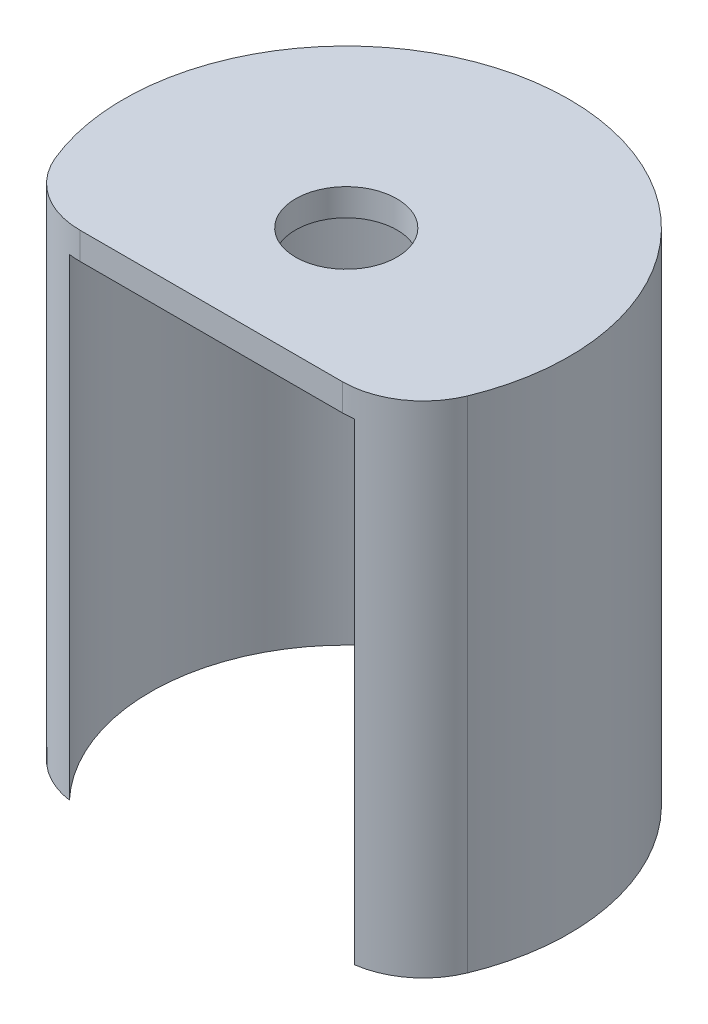
ISO-10303-21;
HEADER;
FILE_DESCRIPTION(('STEP AP214'),'2;1');
FILE_NAME('part.step','',(''),(''),'','','');
FILE_SCHEMA(('AUTOMOTIVE_DESIGN { 1 0 10303 214 1 1 1 1 }'));
ENDSEC;
DATA;
#1=APPLICATION_CONTEXT('core data for automotive mechanical design processes');
#2=APPLICATION_PROTOCOL_DEFINITION('international standard','automotive_design',2000,#1);
#3=PRODUCT_CONTEXT('',#1,'mechanical');
#4=PRODUCT('Part','Part','',(#3));
#5=PRODUCT_RELATED_PRODUCT_CATEGORY('part','',(#4));
#6=PRODUCT_DEFINITION_FORMATION('','',#4);
#7=PRODUCT_DEFINITION_CONTEXT('part definition',#1,'design');
#8=PRODUCT_DEFINITION('design','',#6,#7);
#9=PRODUCT_DEFINITION_SHAPE('','',#8);
#10=(LENGTH_UNIT() NAMED_UNIT(*) SI_UNIT(.MILLI.,.METRE.));
#11=(NAMED_UNIT(*) PLANE_ANGLE_UNIT() SI_UNIT($,.RADIAN.));
#12=(NAMED_UNIT(*) SI_UNIT($,.STERADIAN.) SOLID_ANGLE_UNIT());
#13=UNCERTAINTY_MEASURE_WITH_UNIT(LENGTH_MEASURE(1.E-05),#10,'distance_accuracy_value','');
#14=(GEOMETRIC_REPRESENTATION_CONTEXT(3) GLOBAL_UNCERTAINTY_ASSIGNED_CONTEXT((#13)) GLOBAL_UNIT_ASSIGNED_CONTEXT((#10,
#11,#12)) REPRESENTATION_CONTEXT('',''));
#15=CARTESIAN_POINT('',(0.,0.,0.));
#16=DIRECTION('',(0.,0.,1.));
#17=DIRECTION('',(1.,0.,0.));
#18=AXIS2_PLACEMENT_3D('',#15,#16,#17);
#19=CARTESIAN_POINT('',(0.,0.,0.));
#20=DIRECTION('',(0.,1.,0.));
#21=DIRECTION('',(0.,0.,1.));
#22=AXIS2_PLACEMENT_3D('',#19,#20,#21);
#23=PLANE('',#22);
#24=CARTESIAN_POINT('',(0.,0.,0.));
#25=DIRECTION('',(0.,1.,0.));
#26=DIRECTION('',(0.,0.,1.));
#27=AXIS2_PLACEMENT_3D('',#24,#25,#26);
#28=CIRCLE('',#27,14.5);
#29=CARTESIAN_POINT('',(10.5571544737025,0.,9.93964231843291));
#30=VERTEX_POINT('',#29);
#31=CARTESIAN_POINT('',(-10.5571544737025,0.,9.93964231843291));
#32=VERTEX_POINT('',#31);
#33=EDGE_CURVE('E135',#30,#32,#28,.T.);
#34=ORIENTED_EDGE('',*,*,#33,.T.);
#35=CARTESIAN_POINT('',(-9.7082439194738,0.,4.));
#36=DIRECTION('',(0.,1.,0.));
#37=DIRECTION('',(0.,0.,1.));
#38=AXIS2_PLACEMENT_3D('',#35,#36,#37);
#39=CIRCLE('',#38,6.);
#40=CARTESIAN_POINT('',(-15.2558118734588,0.,6.28571428571428));
#41=VERTEX_POINT('',#40);
#42=EDGE_CURVE('E155',#32,#41,#39,.F.);
#43=ORIENTED_EDGE('',*,*,#42,.T.);
#44=CARTESIAN_POINT('',(0.,0.,0.));
#45=DIRECTION('',(0.,1.,0.));
#46=DIRECTION('',(0.,0.,1.));
#47=AXIS2_PLACEMENT_3D('',#44,#45,#46);
#48=CIRCLE('',#47,16.5);
#49=CARTESIAN_POINT('',(15.2558118734588,0.,6.28571428571428));
#50=VERTEX_POINT('',#49);
#51=EDGE_CURVE('E139',#50,#41,#48,.T.);
#52=ORIENTED_EDGE('',*,*,#51,.F.);
#53=CARTESIAN_POINT('',(9.7082439194738,0.,4.));
#54=DIRECTION('',(0.,1.,0.));
#55=DIRECTION('',(0.,0.,1.));
#56=AXIS2_PLACEMENT_3D('',#53,#54,#55);
#57=CIRCLE('',#56,6.);
#58=EDGE_CURVE('E152',#50,#30,#57,.F.);
#59=ORIENTED_EDGE('',*,*,#58,.T.);
#60=EDGE_LOOP('',(#34,#43,#52,#59));
#61=FACE_BOUND('',#60,.T.);
#62=ADVANCED_FACE('F39',(#61),#23,.F.);
#63=CARTESIAN_POINT('',(0.,35.,0.));
#64=DIRECTION('',(0.,-1.,0.));
#65=DIRECTION('',(0.,0.,-1.));
#66=AXIS2_PLACEMENT_3D('',#63,#64,#65);
#67=CYLINDRICAL_SURFACE('',#66,16.5);
#68=ORIENTED_EDGE('',*,*,#51,.T.);
#69=DIRECTION('',(0.,-1.,0.));
#70=VECTOR('',#69,1.);
#71=CARTESIAN_POINT('',(-15.2558118734588,35.,6.28571428571429));
#72=LINE('',#71,#70);
#73=CARTESIAN_POINT('',(-15.2558118734588,37.,6.28571428571428));
#74=VERTEX_POINT('',#73);
#75=EDGE_CURVE('E55',#41,#74,#72,.F.);
#76=ORIENTED_EDGE('',*,*,#75,.T.);
#77=CARTESIAN_POINT('',(0.,37.,0.));
#78=DIRECTION('',(0.,1.,0.));
#79=DIRECTION('',(0.,0.,1.));
#80=AXIS2_PLACEMENT_3D('',#77,#78,#79);
#81=CIRCLE('',#80,16.5);
#82=CARTESIAN_POINT('',(15.2558118734588,37.,6.28571428571428));
#83=VERTEX_POINT('',#82);
#84=EDGE_CURVE('E121',#83,#74,#81,.T.);
#85=ORIENTED_EDGE('',*,*,#84,.F.);
#86=DIRECTION('',(0.,-1.,0.));
#87=VECTOR('',#86,1.);
#88=CARTESIAN_POINT('',(15.2558118734588,35.,6.28571428571429));
#89=LINE('',#88,#87);
#90=EDGE_CURVE('E158',#83,#50,#89,.T.);
#91=ORIENTED_EDGE('',*,*,#90,.T.);
#92=EDGE_LOOP('',(#68,#76,#85,#91));
#93=FACE_BOUND('',#92,.T.);
#94=ADVANCED_FACE('F165',(#93),#67,.T.);
#95=CARTESIAN_POINT('',(0.,35.,0.));
#96=DIRECTION('',(0.,-1.,0.));
#97=DIRECTION('',(0.,0.,-1.));
#98=AXIS2_PLACEMENT_3D('',#95,#96,#97);
#99=CYLINDRICAL_SURFACE('',#98,14.5);
#100=CARTESIAN_POINT('',(0.,35.,0.));
#101=DIRECTION('',(0.,1.,0.));
#102=DIRECTION('',(0.,0.,1.));
#103=AXIS2_PLACEMENT_3D('',#100,#101,#102);
#104=CIRCLE('',#103,14.5);
#105=CARTESIAN_POINT('',(10.5571544737025,35.,9.93964231843291));
#106=VERTEX_POINT('',#105);
#107=CARTESIAN_POINT('',(-10.5571544737025,35.,9.93964231843291));
#108=VERTEX_POINT('',#107);
#109=EDGE_CURVE('E126',#106,#108,#104,.T.);
#110=ORIENTED_EDGE('',*,*,#109,.T.);
#111=DIRECTION('',(0.,-1.,0.));
#112=VECTOR('',#111,1.);
#113=CARTESIAN_POINT('',(-10.5571544737025,35.,9.93964231843291));
#114=LINE('',#113,#112);
#115=EDGE_CURVE('E98',#108,#32,#114,.T.);
#116=ORIENTED_EDGE('',*,*,#115,.T.);
#117=ORIENTED_EDGE('',*,*,#33,.F.);
#118=DIRECTION('',(0.,-1.,0.));
#119=VECTOR('',#118,1.);
#120=CARTESIAN_POINT('',(10.5571544737025,0.,9.93964231843291));
#121=LINE('',#120,#119);
#122=EDGE_CURVE('E104',#30,#106,#121,.F.);
#123=ORIENTED_EDGE('',*,*,#122,.T.);
#124=EDGE_LOOP('',(#110,#116,#117,#123));
#125=FACE_BOUND('',#124,.T.);
#126=ADVANCED_FACE('F172',(#125),#99,.F.);
#127=CARTESIAN_POINT('',(0.,35.,0.));
#128=DIRECTION('',(0.,1.,0.));
#129=DIRECTION('',(0.,0.,1.));
#130=AXIS2_PLACEMENT_3D('',#127,#128,#129);
#131=PLANE('',#130);
#132=CARTESIAN_POINT('',(0.,35.,0.));
#133=DIRECTION('',(0.,1.,0.));
#134=DIRECTION('',(0.,0.,1.));
#135=AXIS2_PLACEMENT_3D('',#132,#133,#134);
#136=CIRCLE('',#135,3.75);
#137=CARTESIAN_POINT('',(0.,35.,3.75));
#138=VERTEX_POINT('',#137);
#139=EDGE_CURVE('E122',#138,#138,#136,.F.);
#140=ORIENTED_EDGE('',*,*,#139,.F.);
#141=EDGE_LOOP('',(#140));
#142=FACE_BOUND('',#141,.T.);
#143=DIRECTION('',(1.,0.,0.));
#144=VECTOR('',#143,1.);
#145=CARTESIAN_POINT('',(0.,35.,10.));
#146=LINE('',#145,#144);
#147=CARTESIAN_POINT('',(-9.7082439194738,35.,10.));
#148=VERTEX_POINT('',#147);
#149=CARTESIAN_POINT('',(9.7082439194738,35.,10.));
#150=VERTEX_POINT('',#149);
#151=EDGE_CURVE('E112',#148,#150,#146,.T.);
#152=ORIENTED_EDGE('',*,*,#151,.F.);
#153=CARTESIAN_POINT('',(-9.7082439194738,35.,4.));
#154=DIRECTION('',(0.,1.,0.));
#155=DIRECTION('',(0.,0.,1.));
#156=AXIS2_PLACEMENT_3D('',#153,#154,#155);
#157=CIRCLE('',#156,6.);
#158=EDGE_CURVE('E92',#148,#108,#157,.F.);
#159=ORIENTED_EDGE('',*,*,#158,.T.);
#160=ORIENTED_EDGE('',*,*,#109,.F.);
#161=CARTESIAN_POINT('',(9.7082439194738,35.,4.));
#162=DIRECTION('',(0.,1.,0.));
#163=DIRECTION('',(0.,0.,1.));
#164=AXIS2_PLACEMENT_3D('',#161,#162,#163);
#165=CIRCLE('',#164,6.);
#166=EDGE_CURVE('E105',#106,#150,#165,.F.);
#167=ORIENTED_EDGE('',*,*,#166,.T.);
#168=EDGE_LOOP('',(#152,#159,#160,#167));
#169=FACE_BOUND('',#168,.T.);
#170=ADVANCED_FACE('F118',(#142,#169),#131,.F.);
#171=CARTESIAN_POINT('',(0.,37.,0.));
#172=DIRECTION('',(0.,1.,0.));
#173=DIRECTION('',(0.,0.,1.));
#174=AXIS2_PLACEMENT_3D('',#171,#172,#173);
#175=PLANE('',#174);
#176=CARTESIAN_POINT('',(0.,37.,0.));
#177=DIRECTION('',(0.,1.,0.));
#178=DIRECTION('',(0.,0.,1.));
#179=AXIS2_PLACEMENT_3D('',#176,#177,#178);
#180=CIRCLE('',#179,3.75);
#181=CARTESIAN_POINT('',(0.,37.,3.75));
#182=VERTEX_POINT('',#181);
#183=EDGE_CURVE('E129',#182,#182,#180,.T.);
#184=ORIENTED_EDGE('',*,*,#183,.F.);
#185=EDGE_LOOP('',(#184));
#186=FACE_BOUND('',#185,.T.);
#187=ORIENTED_EDGE('',*,*,#84,.T.);
#188=CARTESIAN_POINT('',(-9.7082439194738,37.,4.));
#189=DIRECTION('',(0.,1.,0.));
#190=DIRECTION('',(0.,0.,1.));
#191=AXIS2_PLACEMENT_3D('',#188,#189,#190);
#192=CIRCLE('',#191,6.);
#193=CARTESIAN_POINT('',(-9.7082439194738,37.,10.));
#194=VERTEX_POINT('',#193);
#195=EDGE_CURVE('E11',#74,#194,#192,.T.);
#196=ORIENTED_EDGE('',*,*,#195,.T.);
#197=DIRECTION('',(1.,0.,0.));
#198=VECTOR('',#197,1.);
#199=CARTESIAN_POINT('',(0.,37.,10.));
#200=LINE('',#199,#198);
#201=CARTESIAN_POINT('',(9.7082439194738,37.,10.));
#202=VERTEX_POINT('',#201);
#203=EDGE_CURVE('E114',#194,#202,#200,.T.);
#204=ORIENTED_EDGE('',*,*,#203,.T.);
#205=CARTESIAN_POINT('',(9.7082439194738,37.,4.));
#206=DIRECTION('',(0.,1.,0.));
#207=DIRECTION('',(0.,0.,1.));
#208=AXIS2_PLACEMENT_3D('',#205,#206,#207);
#209=CIRCLE('',#208,6.);
#210=EDGE_CURVE('E48',#202,#83,#209,.T.);
#211=ORIENTED_EDGE('',*,*,#210,.T.);
#212=EDGE_LOOP('',(#187,#196,#204,#211));
#213=FACE_BOUND('',#212,.T.);
#214=ADVANCED_FACE('F173',(#186,#213),#175,.T.);
#215=CARTESIAN_POINT('',(0.,0.,10.));
#216=DIRECTION('',(0.,0.,1.));
#217=DIRECTION('',(1.,0.,0.));
#218=AXIS2_PLACEMENT_3D('',#215,#216,#217);
#219=PLANE('',#218);
#220=ORIENTED_EDGE('',*,*,#203,.F.);
#221=DIRECTION('',(0.,1.,0.));
#222=VECTOR('',#221,1.);
#223=CARTESIAN_POINT('',(-9.7082439194738,0.,10.));
#224=LINE('',#223,#222);
#225=EDGE_CURVE('E96',#194,#148,#224,.F.);
#226=ORIENTED_EDGE('',*,*,#225,.T.);
#227=ORIENTED_EDGE('',*,*,#151,.T.);
#228=DIRECTION('',(0.,1.,0.));
#229=VECTOR('',#228,1.);
#230=CARTESIAN_POINT('',(9.7082439194738,37.,10.));
#231=LINE('',#230,#229);
#232=EDGE_CURVE('E116',#150,#202,#231,.T.);
#233=ORIENTED_EDGE('',*,*,#232,.T.);
#234=EDGE_LOOP('',(#220,#226,#227,#233));
#235=FACE_BOUND('',#234,.T.);
#236=ADVANCED_FACE('F110',(#235),#219,.T.);
#237=CARTESIAN_POINT('',(0.,-0.001000000000001,0.));
#238=DIRECTION('',(0.,1.,0.));
#239=DIRECTION('',(0.,0.,1.));
#240=AXIS2_PLACEMENT_3D('',#237,#238,#239);
#241=CYLINDRICAL_SURFACE('',#240,3.75);
#242=ORIENTED_EDGE('',*,*,#183,.T.);
#243=EDGE_LOOP('',(#242));
#244=FACE_BOUND('',#243,.T.);
#245=ORIENTED_EDGE('',*,*,#139,.T.);
#246=EDGE_LOOP('',(#245));
#247=FACE_BOUND('',#246,.T.);
#248=ADVANCED_FACE('F181',(#244,#247),#241,.F.);
#249=CARTESIAN_POINT('',(-9.7082439194738,35.,4.));
#250=DIRECTION('',(0.,-1.,0.));
#251=DIRECTION('',(0.,0.,-1.));
#252=AXIS2_PLACEMENT_3D('',#249,#250,#251);
#253=CYLINDRICAL_SURFACE('',#252,6.);
#254=ORIENTED_EDGE('',*,*,#195,.F.);
#255=ORIENTED_EDGE('',*,*,#75,.F.);
#256=ORIENTED_EDGE('',*,*,#42,.F.);
#257=ORIENTED_EDGE('',*,*,#115,.F.);
#258=ORIENTED_EDGE('',*,*,#158,.F.);
#259=ORIENTED_EDGE('',*,*,#225,.F.);
#260=EDGE_LOOP('',(#254,#255,#256,#257,#258,#259));
#261=FACE_BOUND('',#260,.T.);
#262=ADVANCED_FACE('F95',(#261),#253,.T.);
#263=CARTESIAN_POINT('',(9.7082439194738,35.,4.));
#264=DIRECTION('',(0.,-1.,0.));
#265=DIRECTION('',(0.,0.,-1.));
#266=AXIS2_PLACEMENT_3D('',#263,#264,#265);
#267=CYLINDRICAL_SURFACE('',#266,6.);
#268=ORIENTED_EDGE('',*,*,#58,.F.);
#269=ORIENTED_EDGE('',*,*,#90,.F.);
#270=ORIENTED_EDGE('',*,*,#210,.F.);
#271=ORIENTED_EDGE('',*,*,#232,.F.);
#272=ORIENTED_EDGE('',*,*,#166,.F.);
#273=ORIENTED_EDGE('',*,*,#122,.F.);
#274=EDGE_LOOP('',(#268,#269,#270,#271,#272,#273));
#275=FACE_BOUND('',#274,.T.);
#276=ADVANCED_FACE('F41',(#275),#267,.T.);
#277=CLOSED_SHELL('',(#62,#94,#126,#170,#214,#236,#248,#262,#276));
#278=MANIFOLD_SOLID_BREP('B2',#277);
#279=ADVANCED_BREP_SHAPE_REPRESENTATION('',(#18,#278),#14);
#280=SHAPE_DEFINITION_REPRESENTATION(#9,#279);
ENDSEC;
END-ISO-10303-21;
